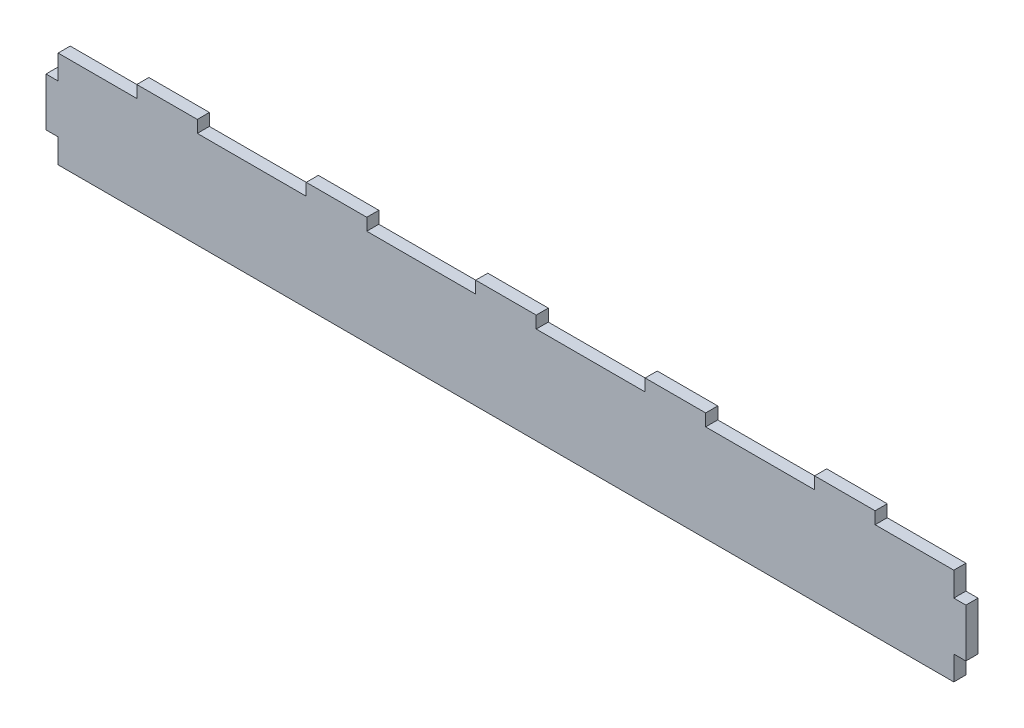
ISO-10303-21;
HEADER;
FILE_DESCRIPTION(('STEP AP214'),'2;1');
FILE_NAME('part.step','',(''),(''),'','','');
FILE_SCHEMA(('AUTOMOTIVE_DESIGN { 1 0 10303 214 1 1 1 1 }'));
ENDSEC;
DATA;
#1=APPLICATION_CONTEXT('core data for automotive mechanical design processes');
#2=APPLICATION_PROTOCOL_DEFINITION('international standard','automotive_design',2000,#1);
#3=PRODUCT_CONTEXT('',#1,'mechanical');
#4=PRODUCT('Part','Part','',(#3));
#5=PRODUCT_RELATED_PRODUCT_CATEGORY('part','',(#4));
#6=PRODUCT_DEFINITION_FORMATION('','',#4);
#7=PRODUCT_DEFINITION_CONTEXT('part definition',#1,'design');
#8=PRODUCT_DEFINITION('design','',#6,#7);
#9=PRODUCT_DEFINITION_SHAPE('','',#8);
#10=(LENGTH_UNIT() NAMED_UNIT(*) SI_UNIT(.MILLI.,.METRE.));
#11=(NAMED_UNIT(*) PLANE_ANGLE_UNIT() SI_UNIT($,.RADIAN.));
#12=(NAMED_UNIT(*) SI_UNIT($,.STERADIAN.) SOLID_ANGLE_UNIT());
#13=UNCERTAINTY_MEASURE_WITH_UNIT(LENGTH_MEASURE(1.E-05),#10,'distance_accuracy_value','');
#14=(GEOMETRIC_REPRESENTATION_CONTEXT(3) GLOBAL_UNCERTAINTY_ASSIGNED_CONTEXT((#13)) GLOBAL_UNIT_ASSIGNED_CONTEXT((#10,
#11,#12)) REPRESENTATION_CONTEXT('',''));
#15=CARTESIAN_POINT('',(0.,0.,0.));
#16=DIRECTION('',(0.,0.,1.));
#17=DIRECTION('',(1.,0.,0.));
#18=AXIS2_PLACEMENT_3D('',#15,#16,#17);
#19=CARTESIAN_POINT('',(72.5000000000003,0.,2.5));
#20=DIRECTION('',(-1.,0.,0.));
#21=DIRECTION('',(0.,0.,1.));
#22=AXIS2_PLACEMENT_3D('',#19,#20,#21);
#23=PLANE('',#22);
#24=DIRECTION('',(0.,1.,0.));
#25=VECTOR('',#24,1.);
#26=CARTESIAN_POINT('',(72.5000000000003,0.,-2.5));
#27=LINE('',#26,#25);
#28=CARTESIAN_POINT('',(72.5000000000003,-24.9999999999885,-2.5));
#29=VERTEX_POINT('',#28);
#30=CARTESIAN_POINT('',(72.5000000000003,-19.9999999999999,-2.5));
#31=VERTEX_POINT('',#30);
#32=EDGE_CURVE('E277',#29,#31,#27,.T.);
#33=ORIENTED_EDGE('',*,*,#32,.F.);
#34=DIRECTION('',(0.,0.,-1.));
#35=VECTOR('',#34,1.);
#36=CARTESIAN_POINT('',(72.5000000000003,-24.9999999999885,2.5));
#37=LINE('',#36,#35);
#38=CARTESIAN_POINT('',(72.5000000000003,-24.9999999999885,2.5));
#39=VERTEX_POINT('',#38);
#40=EDGE_CURVE('E11',#39,#29,#37,.T.);
#41=ORIENTED_EDGE('',*,*,#40,.F.);
#42=DIRECTION('',(0.,1.,0.));
#43=VECTOR('',#42,1.);
#44=CARTESIAN_POINT('',(72.5000000000003,0.,2.5));
#45=LINE('',#44,#43);
#46=CARTESIAN_POINT('',(72.5000000000003,-19.9999999999999,2.5));
#47=VERTEX_POINT('',#46);
#48=EDGE_CURVE('E362',#39,#47,#45,.T.);
#49=ORIENTED_EDGE('',*,*,#48,.T.);
#50=DIRECTION('',(0.,0.,-1.));
#51=VECTOR('',#50,1.);
#52=CARTESIAN_POINT('',(72.5000000000003,-19.9999999999999,2.5));
#53=LINE('',#52,#51);
#54=EDGE_CURVE('E55',#47,#31,#53,.T.);
#55=ORIENTED_EDGE('',*,*,#54,.T.);
#56=EDGE_LOOP('',(#33,#41,#49,#55));
#57=FACE_BOUND('',#56,.T.);
#58=ADVANCED_FACE('F39',(#57),#23,.T.);
#59=CARTESIAN_POINT('',(0.,-24.9999999999885,2.5));
#60=DIRECTION('',(0.,-1.,0.));
#61=DIRECTION('',(0.,0.,-1.));
#62=AXIS2_PLACEMENT_3D('',#59,#60,#61);
#63=PLANE('',#62);
#64=DIRECTION('',(-1.,0.,0.));
#65=VECTOR('',#64,1.);
#66=CARTESIAN_POINT('',(0.,-24.9999999999885,-2.5));
#67=LINE('',#66,#65);
#68=CARTESIAN_POINT('',(40.,-24.9999999999885,-2.5));
#69=VERTEX_POINT('',#68);
#70=EDGE_CURVE('E279',#29,#69,#67,.T.);
#71=ORIENTED_EDGE('',*,*,#70,.T.);
#72=DIRECTION('',(0.,0.,-1.));
#73=VECTOR('',#72,1.);
#74=CARTESIAN_POINT('',(40.,-24.9999999999885,2.5));
#75=LINE('',#74,#73);
#76=CARTESIAN_POINT('',(40.,-24.9999999999885,2.5));
#77=VERTEX_POINT('',#76);
#78=EDGE_CURVE('E47',#77,#69,#75,.T.);
#79=ORIENTED_EDGE('',*,*,#78,.F.);
#80=DIRECTION('',(-1.,0.,0.));
#81=VECTOR('',#80,1.);
#82=CARTESIAN_POINT('',(0.,-24.9999999999885,2.5));
#83=LINE('',#82,#81);
#84=EDGE_CURVE('E448',#39,#77,#83,.T.);
#85=ORIENTED_EDGE('',*,*,#84,.F.);
#86=ORIENTED_EDGE('',*,*,#40,.T.);
#87=EDGE_LOOP('',(#71,#79,#85,#86));
#88=FACE_BOUND('',#87,.T.);
#89=ADVANCED_FACE('F523',(#88),#63,.F.);
#90=CARTESIAN_POINT('',(40.,0.,2.5));
#91=DIRECTION('',(1.,0.,0.));
#92=DIRECTION('',(0.,0.,-1.));
#93=AXIS2_PLACEMENT_3D('',#90,#91,#92);
#94=PLANE('',#93);
#95=DIRECTION('',(0.,-1.,0.));
#96=VECTOR('',#95,1.);
#97=CARTESIAN_POINT('',(40.,0.,-2.5));
#98=LINE('',#97,#96);
#99=CARTESIAN_POINT('',(40.,-34.9999999999883,-2.5));
#100=VERTEX_POINT('',#99);
#101=EDGE_CURVE('E281',#69,#100,#98,.T.);
#102=ORIENTED_EDGE('',*,*,#101,.T.);
#103=DIRECTION('',(0.,0.,-1.));
#104=VECTOR('',#103,1.);
#105=CARTESIAN_POINT('',(40.,-34.9999999999883,2.5));
#106=LINE('',#105,#104);
#107=CARTESIAN_POINT('',(40.,-34.9999999999883,2.5));
#108=VERTEX_POINT('',#107);
#109=EDGE_CURVE('E421',#108,#100,#106,.T.);
#110=ORIENTED_EDGE('',*,*,#109,.F.);
#111=DIRECTION('',(0.,-1.,0.));
#112=VECTOR('',#111,1.);
#113=CARTESIAN_POINT('',(40.,0.,2.5));
#114=LINE('',#113,#112);
#115=EDGE_CURVE('E430',#77,#108,#114,.T.);
#116=ORIENTED_EDGE('',*,*,#115,.F.);
#117=ORIENTED_EDGE('',*,*,#78,.T.);
#118=EDGE_LOOP('',(#102,#110,#116,#117));
#119=FACE_BOUND('',#118,.T.);
#120=ADVANCED_FACE('F428',(#119),#94,.F.);
#121=CARTESIAN_POINT('',(0.,-34.9999999999883,2.5));
#122=DIRECTION('',(0.,-1.,0.));
#123=DIRECTION('',(0.,0.,-1.));
#124=AXIS2_PLACEMENT_3D('',#121,#122,#123);
#125=PLANE('',#124);
#126=DIRECTION('',(-1.,0.,0.));
#127=VECTOR('',#126,1.);
#128=CARTESIAN_POINT('',(0.,-34.9999999999883,-2.5));
#129=LINE('',#128,#127);
#130=CARTESIAN_POINT('',(35.,-34.9999999999883,-2.5));
#131=VERTEX_POINT('',#130);
#132=EDGE_CURVE('E283',#100,#131,#129,.T.);
#133=ORIENTED_EDGE('',*,*,#132,.T.);
#134=DIRECTION('',(0.,0.,-1.));
#135=VECTOR('',#134,1.);
#136=CARTESIAN_POINT('',(35.,-34.9999999999883,2.5));
#137=LINE('',#136,#135);
#138=CARTESIAN_POINT('',(35.,-34.9999999999883,2.5));
#139=VERTEX_POINT('',#138);
#140=EDGE_CURVE('E419',#139,#131,#137,.T.);
#141=ORIENTED_EDGE('',*,*,#140,.F.);
#142=DIRECTION('',(-1.,0.,0.));
#143=VECTOR('',#142,1.);
#144=CARTESIAN_POINT('',(0.,-34.9999999999883,2.5));
#145=LINE('',#144,#143);
#146=EDGE_CURVE('E442',#108,#139,#145,.T.);
#147=ORIENTED_EDGE('',*,*,#146,.F.);
#148=ORIENTED_EDGE('',*,*,#109,.T.);
#149=EDGE_LOOP('',(#133,#141,#147,#148));
#150=FACE_BOUND('',#149,.T.);
#151=ADVANCED_FACE('F439',(#150),#125,.F.);
#152=CARTESIAN_POINT('',(34.9999999999999,0.,2.5));
#153=DIRECTION('',(-1.,0.,0.));
#154=DIRECTION('',(0.,-1.,0.));
#155=AXIS2_PLACEMENT_3D('',#152,#153,#154);
#156=PLANE('',#155);
#157=DIRECTION('',(0.,1.,0.));
#158=VECTOR('',#157,1.);
#159=CARTESIAN_POINT('',(34.9999999999999,0.,-2.5));
#160=LINE('',#159,#158);
#161=CARTESIAN_POINT('',(35.,-54.9999999999883,-2.5));
#162=VERTEX_POINT('',#161);
#163=EDGE_CURVE('E286',#162,#131,#160,.T.);
#164=ORIENTED_EDGE('',*,*,#163,.F.);
#165=DIRECTION('',(0.,0.,-1.));
#166=VECTOR('',#165,1.);
#167=CARTESIAN_POINT('',(35.,-54.9999999999883,2.5));
#168=LINE('',#167,#166);
#169=CARTESIAN_POINT('',(35.,-54.9999999999883,2.5));
#170=VERTEX_POINT('',#169);
#171=EDGE_CURVE('E417',#170,#162,#168,.T.);
#172=ORIENTED_EDGE('',*,*,#171,.F.);
#173=DIRECTION('',(0.,1.,0.));
#174=VECTOR('',#173,1.);
#175=CARTESIAN_POINT('',(34.9999999999999,0.,2.5));
#176=LINE('',#175,#174);
#177=EDGE_CURVE('E444',#170,#139,#176,.T.);
#178=ORIENTED_EDGE('',*,*,#177,.T.);
#179=ORIENTED_EDGE('',*,*,#140,.T.);
#180=EDGE_LOOP('',(#164,#172,#178,#179));
#181=FACE_BOUND('',#180,.T.);
#182=ADVANCED_FACE('F534',(#181),#156,.T.);
#183=CARTESIAN_POINT('',(0.,-54.9999999999883,2.5));
#184=DIRECTION('',(0.,-1.,0.));
#185=DIRECTION('',(0.,0.,-1.));
#186=AXIS2_PLACEMENT_3D('',#183,#184,#185);
#187=PLANE('',#186);
#188=DIRECTION('',(-1.,0.,0.));
#189=VECTOR('',#188,1.);
#190=CARTESIAN_POINT('',(0.,-54.9999999999883,-2.5));
#191=LINE('',#190,#189);
#192=CARTESIAN_POINT('',(40.,-54.9999999999883,-2.5));
#193=VERTEX_POINT('',#192);
#194=EDGE_CURVE('E289',#193,#162,#191,.T.);
#195=ORIENTED_EDGE('',*,*,#194,.F.);
#196=DIRECTION('',(0.,0.,-1.));
#197=VECTOR('',#196,1.);
#198=CARTESIAN_POINT('',(40.,-54.9999999999883,2.5));
#199=LINE('',#198,#197);
#200=CARTESIAN_POINT('',(40.,-54.9999999999883,2.5));
#201=VERTEX_POINT('',#200);
#202=EDGE_CURVE('E415',#201,#193,#199,.T.);
#203=ORIENTED_EDGE('',*,*,#202,.F.);
#204=DIRECTION('',(-1.,0.,0.));
#205=VECTOR('',#204,1.);
#206=CARTESIAN_POINT('',(0.,-54.9999999999883,2.5));
#207=LINE('',#206,#205);
#208=EDGE_CURVE('E446',#201,#170,#207,.T.);
#209=ORIENTED_EDGE('',*,*,#208,.T.);
#210=ORIENTED_EDGE('',*,*,#171,.T.);
#211=EDGE_LOOP('',(#195,#203,#209,#210));
#212=FACE_BOUND('',#211,.T.);
#213=ADVANCED_FACE('F537',(#212),#187,.T.);
#214=CARTESIAN_POINT('',(40.,0.,2.5));
#215=DIRECTION('',(1.,0.,0.));
#216=DIRECTION('',(0.,0.,-1.));
#217=AXIS2_PLACEMENT_3D('',#214,#215,#216);
#218=PLANE('',#217);
#219=DIRECTION('',(0.,-1.,0.));
#220=VECTOR('',#219,1.);
#221=CARTESIAN_POINT('',(40.,0.,-2.5));
#222=LINE('',#221,#220);
#223=CARTESIAN_POINT('',(40.,-64.9999999999886,-2.5));
#224=VERTEX_POINT('',#223);
#225=EDGE_CURVE('E292',#193,#224,#222,.T.);
#226=ORIENTED_EDGE('',*,*,#225,.T.);
#227=DIRECTION('',(0.,0.,-1.));
#228=VECTOR('',#227,1.);
#229=CARTESIAN_POINT('',(40.,-64.9999999999886,2.5));
#230=LINE('',#229,#228);
#231=CARTESIAN_POINT('',(40.,-64.9999999999886,2.5));
#232=VERTEX_POINT('',#231);
#233=EDGE_CURVE('E413',#232,#224,#230,.T.);
#234=ORIENTED_EDGE('',*,*,#233,.F.);
#235=DIRECTION('',(0.,-1.,0.));
#236=VECTOR('',#235,1.);
#237=CARTESIAN_POINT('',(40.,0.,2.5));
#238=LINE('',#237,#236);
#239=EDGE_CURVE('E454',#201,#232,#238,.T.);
#240=ORIENTED_EDGE('',*,*,#239,.F.);
#241=ORIENTED_EDGE('',*,*,#202,.T.);
#242=EDGE_LOOP('',(#226,#234,#240,#241));
#243=FACE_BOUND('',#242,.T.);
#244=ADVANCED_FACE('F541',(#243),#218,.F.);
#245=CARTESIAN_POINT('',(0.,-64.9999999999886,2.5));
#246=DIRECTION('',(0.,-1.,0.));
#247=DIRECTION('',(1.,0.,0.));
#248=AXIS2_PLACEMENT_3D('',#245,#246,#247);
#249=PLANE('',#248);
#250=DIRECTION('',(-1.,0.,0.));
#251=VECTOR('',#250,1.);
#252=CARTESIAN_POINT('',(0.,-64.9999999999886,-2.5));
#253=LINE('',#252,#251);
#254=CARTESIAN_POINT('',(410.000000000001,-64.9999999999885,-2.5));
#255=VERTEX_POINT('',#254);
#256=EDGE_CURVE('E295',#255,#224,#253,.T.);
#257=ORIENTED_EDGE('',*,*,#256,.F.);
#258=DIRECTION('',(0.,0.,-1.));
#259=VECTOR('',#258,1.);
#260=CARTESIAN_POINT('',(410.000000000001,-64.9999999999885,2.5));
#261=LINE('',#260,#259);
#262=CARTESIAN_POINT('',(410.000000000001,-64.9999999999885,2.5));
#263=VERTEX_POINT('',#262);
#264=EDGE_CURVE('E411',#263,#255,#261,.T.);
#265=ORIENTED_EDGE('',*,*,#264,.F.);
#266=DIRECTION('',(-1.,0.,0.));
#267=VECTOR('',#266,1.);
#268=CARTESIAN_POINT('',(0.,-64.9999999999886,2.5));
#269=LINE('',#268,#267);
#270=EDGE_CURVE('E456',#263,#232,#269,.T.);
#271=ORIENTED_EDGE('',*,*,#270,.T.);
#272=ORIENTED_EDGE('',*,*,#233,.T.);
#273=EDGE_LOOP('',(#257,#265,#271,#272));
#274=FACE_BOUND('',#273,.T.);
#275=ADVANCED_FACE('F545',(#274),#249,.T.);
#276=CARTESIAN_POINT('',(410.000000000001,0.,2.5));
#277=DIRECTION('',(1.,0.,0.));
#278=DIRECTION('',(0.,0.,-1.));
#279=AXIS2_PLACEMENT_3D('',#276,#277,#278);
#280=PLANE('',#279);
#281=DIRECTION('',(0.,-1.,0.));
#282=VECTOR('',#281,1.);
#283=CARTESIAN_POINT('',(410.000000000001,0.,-2.5));
#284=LINE('',#283,#282);
#285=CARTESIAN_POINT('',(410.000000000001,-54.9999999999883,-2.5));
#286=VERTEX_POINT('',#285);
#287=EDGE_CURVE('E298',#286,#255,#284,.T.);
#288=ORIENTED_EDGE('',*,*,#287,.F.);
#289=DIRECTION('',(0.,0.,-1.));
#290=VECTOR('',#289,1.);
#291=CARTESIAN_POINT('',(410.000000000001,-54.9999999999883,2.5));
#292=LINE('',#291,#290);
#293=CARTESIAN_POINT('',(410.000000000001,-54.9999999999883,2.5));
#294=VERTEX_POINT('',#293);
#295=EDGE_CURVE('E409',#294,#286,#292,.T.);
#296=ORIENTED_EDGE('',*,*,#295,.F.);
#297=DIRECTION('',(0.,-1.,0.));
#298=VECTOR('',#297,1.);
#299=CARTESIAN_POINT('',(410.000000000001,0.,2.5));
#300=LINE('',#299,#298);
#301=EDGE_CURVE('E459',#294,#263,#300,.T.);
#302=ORIENTED_EDGE('',*,*,#301,.T.);
#303=ORIENTED_EDGE('',*,*,#264,.T.);
#304=EDGE_LOOP('',(#288,#296,#302,#303));
#305=FACE_BOUND('',#304,.T.);
#306=ADVANCED_FACE('F549',(#305),#280,.T.);
#307=CARTESIAN_POINT('',(0.,-54.9999999999883,2.5));
#308=DIRECTION('',(0.,1.,0.));
#309=DIRECTION('',(0.,0.,1.));
#310=AXIS2_PLACEMENT_3D('',#307,#308,#309);
#311=PLANE('',#310);
#312=DIRECTION('',(1.,0.,0.));
#313=VECTOR('',#312,1.);
#314=CARTESIAN_POINT('',(0.,-54.9999999999883,-2.5));
#315=LINE('',#314,#313);
#316=CARTESIAN_POINT('',(415.000000000001,-54.9999999999883,-2.5));
#317=VERTEX_POINT('',#316);
#318=EDGE_CURVE('E301',#286,#317,#315,.T.);
#319=ORIENTED_EDGE('',*,*,#318,.T.);
#320=DIRECTION('',(0.,0.,-1.));
#321=VECTOR('',#320,1.);
#322=CARTESIAN_POINT('',(415.000000000001,-54.9999999999883,2.5));
#323=LINE('',#322,#321);
#324=CARTESIAN_POINT('',(415.000000000001,-54.9999999999883,2.5));
#325=VERTEX_POINT('',#324);
#326=EDGE_CURVE('E406',#325,#317,#323,.T.);
#327=ORIENTED_EDGE('',*,*,#326,.F.);
#328=DIRECTION('',(1.,0.,0.));
#329=VECTOR('',#328,1.);
#330=CARTESIAN_POINT('',(0.,-54.9999999999883,2.5));
#331=LINE('',#330,#329);
#332=EDGE_CURVE('E462',#294,#325,#331,.T.);
#333=ORIENTED_EDGE('',*,*,#332,.F.);
#334=ORIENTED_EDGE('',*,*,#295,.T.);
#335=EDGE_LOOP('',(#319,#327,#333,#334));
#336=FACE_BOUND('',#335,.T.);
#337=ADVANCED_FACE('F553',(#336),#311,.F.);
#338=CARTESIAN_POINT('',(415.000000000001,-1.1518563880486E-12,2.5));
#339=DIRECTION('',(-1.,0.,0.));
#340=DIRECTION('',(0.,-1.,0.));
#341=AXIS2_PLACEMENT_3D('',#338,#339,#340);
#342=PLANE('',#341);
#343=DIRECTION('',(0.,1.,0.));
#344=VECTOR('',#343,1.);
#345=CARTESIAN_POINT('',(415.000000000001,-1.1518563880486E-12,-2.5));
#346=LINE('',#345,#344);
#347=CARTESIAN_POINT('',(415.000000000001,-34.9999999999883,-2.5));
#348=VERTEX_POINT('',#347);
#349=EDGE_CURVE('E303',#317,#348,#346,.T.);
#350=ORIENTED_EDGE('',*,*,#349,.T.);
#351=DIRECTION('',(0.,0.,-1.));
#352=VECTOR('',#351,1.);
#353=CARTESIAN_POINT('',(415.000000000001,-34.9999999999883,2.5));
#354=LINE('',#353,#352);
#355=CARTESIAN_POINT('',(415.000000000001,-34.9999999999883,2.5));
#356=VERTEX_POINT('',#355);
#357=EDGE_CURVE('E404',#356,#348,#354,.T.);
#358=ORIENTED_EDGE('',*,*,#357,.F.);
#359=DIRECTION('',(0.,1.,0.));
#360=VECTOR('',#359,1.);
#361=CARTESIAN_POINT('',(415.000000000001,-1.1518563880486E-12,2.5));
#362=LINE('',#361,#360);
#363=EDGE_CURVE('E464',#325,#356,#362,.T.);
#364=ORIENTED_EDGE('',*,*,#363,.F.);
#365=ORIENTED_EDGE('',*,*,#326,.T.);
#366=EDGE_LOOP('',(#350,#358,#364,#365));
#367=FACE_BOUND('',#366,.T.);
#368=ADVANCED_FACE('F557',(#367),#342,.F.);
#369=CARTESIAN_POINT('',(0.,-34.9999999999883,2.5));
#370=DIRECTION('',(0.,1.,0.));
#371=DIRECTION('',(0.,0.,1.));
#372=AXIS2_PLACEMENT_3D('',#369,#370,#371);
#373=PLANE('',#372);
#374=DIRECTION('',(1.,0.,0.));
#375=VECTOR('',#374,1.);
#376=CARTESIAN_POINT('',(0.,-34.9999999999883,-2.5));
#377=LINE('',#376,#375);
#378=CARTESIAN_POINT('',(410.000000000001,-34.9999999999883,-2.5));
#379=VERTEX_POINT('',#378);
#380=EDGE_CURVE('E306',#379,#348,#377,.T.);
#381=ORIENTED_EDGE('',*,*,#380,.F.);
#382=DIRECTION('',(0.,0.,-1.));
#383=VECTOR('',#382,1.);
#384=CARTESIAN_POINT('',(410.000000000001,-34.9999999999883,2.5));
#385=LINE('',#384,#383);
#386=CARTESIAN_POINT('',(410.000000000001,-34.9999999999883,2.5));
#387=VERTEX_POINT('',#386);
#388=EDGE_CURVE('E402',#387,#379,#385,.T.);
#389=ORIENTED_EDGE('',*,*,#388,.F.);
#390=DIRECTION('',(1.,0.,0.));
#391=VECTOR('',#390,1.);
#392=CARTESIAN_POINT('',(0.,-34.9999999999883,2.5));
#393=LINE('',#392,#391);
#394=EDGE_CURVE('E466',#387,#356,#393,.T.);
#395=ORIENTED_EDGE('',*,*,#394,.T.);
#396=ORIENTED_EDGE('',*,*,#357,.T.);
#397=EDGE_LOOP('',(#381,#389,#395,#396));
#398=FACE_BOUND('',#397,.T.);
#399=ADVANCED_FACE('F561',(#398),#373,.T.);
#400=CARTESIAN_POINT('',(410.000000000001,0.,2.5));
#401=DIRECTION('',(1.,0.,0.));
#402=DIRECTION('',(0.,0.,-1.));
#403=AXIS2_PLACEMENT_3D('',#400,#401,#402);
#404=PLANE('',#403);
#405=DIRECTION('',(0.,-1.,0.));
#406=VECTOR('',#405,1.);
#407=CARTESIAN_POINT('',(410.000000000001,0.,-2.5));
#408=LINE('',#407,#406);
#409=CARTESIAN_POINT('',(410.000000000001,-24.9999999999885,-2.5));
#410=VERTEX_POINT('',#409);
#411=EDGE_CURVE('E309',#410,#379,#408,.T.);
#412=ORIENTED_EDGE('',*,*,#411,.F.);
#413=DIRECTION('',(0.,0.,-1.));
#414=VECTOR('',#413,1.);
#415=CARTESIAN_POINT('',(410.000000000001,-24.9999999999885,2.5));
#416=LINE('',#415,#414);
#417=CARTESIAN_POINT('',(410.000000000001,-24.9999999999885,2.5));
#418=VERTEX_POINT('',#417);
#419=EDGE_CURVE('E400',#418,#410,#416,.T.);
#420=ORIENTED_EDGE('',*,*,#419,.F.);
#421=DIRECTION('',(0.,-1.,0.));
#422=VECTOR('',#421,1.);
#423=CARTESIAN_POINT('',(410.000000000001,0.,2.5));
#424=LINE('',#423,#422);
#425=EDGE_CURVE('E469',#418,#387,#424,.T.);
#426=ORIENTED_EDGE('',*,*,#425,.T.);
#427=ORIENTED_EDGE('',*,*,#388,.T.);
#428=EDGE_LOOP('',(#412,#420,#426,#427));
#429=FACE_BOUND('',#428,.T.);
#430=ADVANCED_FACE('F565',(#429),#404,.T.);
#431=CARTESIAN_POINT('',(0.,-24.9999999999885,2.5));
#432=DIRECTION('',(0.,-1.,0.));
#433=DIRECTION('',(0.,0.,-1.));
#434=AXIS2_PLACEMENT_3D('',#431,#432,#433);
#435=PLANE('',#434);
#436=DIRECTION('',(-1.,0.,0.));
#437=VECTOR('',#436,1.);
#438=CARTESIAN_POINT('',(0.,-24.9999999999885,-2.5));
#439=LINE('',#438,#437);
#440=CARTESIAN_POINT('',(377.5,-24.9999999999885,-2.5));
#441=VERTEX_POINT('',#440);
#442=EDGE_CURVE('E312',#410,#441,#439,.T.);
#443=ORIENTED_EDGE('',*,*,#442,.T.);
#444=DIRECTION('',(0.,0.,-1.));
#445=VECTOR('',#444,1.);
#446=CARTESIAN_POINT('',(377.5,-24.9999999999885,2.5));
#447=LINE('',#446,#445);
#448=CARTESIAN_POINT('',(377.5,-24.9999999999885,2.5));
#449=VERTEX_POINT('',#448);
#450=EDGE_CURVE('E397',#449,#441,#447,.T.);
#451=ORIENTED_EDGE('',*,*,#450,.F.);
#452=DIRECTION('',(-1.,0.,0.));
#453=VECTOR('',#452,1.);
#454=CARTESIAN_POINT('',(0.,-24.9999999999885,2.5));
#455=LINE('',#454,#453);
#456=EDGE_CURVE('E472',#418,#449,#455,.T.);
#457=ORIENTED_EDGE('',*,*,#456,.F.);
#458=ORIENTED_EDGE('',*,*,#419,.T.);
#459=EDGE_LOOP('',(#443,#451,#457,#458));
#460=FACE_BOUND('',#459,.T.);
#461=ADVANCED_FACE('F569',(#460),#435,.F.);
#462=CARTESIAN_POINT('',(377.5,0.,2.5));
#463=DIRECTION('',(-1.,0.,0.));
#464=DIRECTION('',(0.,0.,1.));
#465=AXIS2_PLACEMENT_3D('',#462,#463,#464);
#466=PLANE('',#465);
#467=DIRECTION('',(0.,1.,0.));
#468=VECTOR('',#467,1.);
#469=CARTESIAN_POINT('',(377.5,0.,-2.5));
#470=LINE('',#469,#468);
#471=CARTESIAN_POINT('',(377.5,-19.9999999999999,-2.5));
#472=VERTEX_POINT('',#471);
#473=EDGE_CURVE('E314',#441,#472,#470,.T.);
#474=ORIENTED_EDGE('',*,*,#473,.T.);
#475=DIRECTION('',(0.,0.,-1.));
#476=VECTOR('',#475,1.);
#477=CARTESIAN_POINT('',(377.5,-19.9999999999999,2.5));
#478=LINE('',#477,#476);
#479=CARTESIAN_POINT('',(377.5,-19.9999999999999,2.5));
#480=VERTEX_POINT('',#479);
#481=EDGE_CURVE('E395',#480,#472,#478,.T.);
#482=ORIENTED_EDGE('',*,*,#481,.F.);
#483=DIRECTION('',(0.,1.,0.));
#484=VECTOR('',#483,1.);
#485=CARTESIAN_POINT('',(377.5,0.,2.5));
#486=LINE('',#485,#484);
#487=EDGE_CURVE('E474',#449,#480,#486,.T.);
#488=ORIENTED_EDGE('',*,*,#487,.F.);
#489=ORIENTED_EDGE('',*,*,#450,.T.);
#490=EDGE_LOOP('',(#474,#482,#488,#489));
#491=FACE_BOUND('',#490,.T.);
#492=ADVANCED_FACE('F573',(#491),#466,.F.);
#493=CARTESIAN_POINT('',(0.,-19.9999999999999,2.5));
#494=DIRECTION('',(0.,1.,0.));
#495=DIRECTION('',(0.,0.,1.));
#496=AXIS2_PLACEMENT_3D('',#493,#494,#495);
#497=PLANE('',#496);
#498=DIRECTION('',(1.,0.,0.));
#499=VECTOR('',#498,1.);
#500=CARTESIAN_POINT('',(0.,-19.9999999999999,-2.5));
#501=LINE('',#500,#499);
#502=CARTESIAN_POINT('',(352.5,-19.9999999999999,-2.5));
#503=VERTEX_POINT('',#502);
#504=EDGE_CURVE('E317',#503,#472,#501,.T.);
#505=ORIENTED_EDGE('',*,*,#504,.F.);
#506=DIRECTION('',(0.,0.,-1.));
#507=VECTOR('',#506,1.);
#508=CARTESIAN_POINT('',(352.5,-19.9999999999999,2.5));
#509=LINE('',#508,#507);
#510=CARTESIAN_POINT('',(352.5,-19.9999999999999,2.5));
#511=VERTEX_POINT('',#510);
#512=EDGE_CURVE('E393',#511,#503,#509,.T.);
#513=ORIENTED_EDGE('',*,*,#512,.F.);
#514=DIRECTION('',(1.,0.,0.));
#515=VECTOR('',#514,1.);
#516=CARTESIAN_POINT('',(0.,-19.9999999999999,2.5));
#517=LINE('',#516,#515);
#518=EDGE_CURVE('E476',#511,#480,#517,.T.);
#519=ORIENTED_EDGE('',*,*,#518,.T.);
#520=ORIENTED_EDGE('',*,*,#481,.T.);
#521=EDGE_LOOP('',(#505,#513,#519,#520));
#522=FACE_BOUND('',#521,.T.);
#523=ADVANCED_FACE('F577',(#522),#497,.T.);
#524=CARTESIAN_POINT('',(352.5,0.,2.5));
#525=DIRECTION('',(-1.,0.,0.));
#526=DIRECTION('',(0.,0.,1.));
#527=AXIS2_PLACEMENT_3D('',#524,#525,#526);
#528=PLANE('',#527);
#529=DIRECTION('',(0.,1.,0.));
#530=VECTOR('',#529,1.);
#531=CARTESIAN_POINT('',(352.5,0.,-2.5));
#532=LINE('',#531,#530);
#533=CARTESIAN_POINT('',(352.5,-24.9999999999885,-2.5));
#534=VERTEX_POINT('',#533);
#535=EDGE_CURVE('E320',#534,#503,#532,.T.);
#536=ORIENTED_EDGE('',*,*,#535,.F.);
#537=DIRECTION('',(0.,0.,-1.));
#538=VECTOR('',#537,1.);
#539=CARTESIAN_POINT('',(352.5,-24.9999999999885,2.5));
#540=LINE('',#539,#538);
#541=CARTESIAN_POINT('',(352.5,-24.9999999999885,2.5));
#542=VERTEX_POINT('',#541);
#543=EDGE_CURVE('E391',#542,#534,#540,.T.);
#544=ORIENTED_EDGE('',*,*,#543,.F.);
#545=DIRECTION('',(0.,1.,0.));
#546=VECTOR('',#545,1.);
#547=CARTESIAN_POINT('',(352.5,0.,2.5));
#548=LINE('',#547,#546);
#549=EDGE_CURVE('E479',#542,#511,#548,.T.);
#550=ORIENTED_EDGE('',*,*,#549,.T.);
#551=ORIENTED_EDGE('',*,*,#512,.T.);
#552=EDGE_LOOP('',(#536,#544,#550,#551));
#553=FACE_BOUND('',#552,.T.);
#554=ADVANCED_FACE('F581',(#553),#528,.T.);
#555=CARTESIAN_POINT('',(0.,-24.9999999999885,2.5));
#556=DIRECTION('',(0.,-1.,0.));
#557=DIRECTION('',(0.,0.,-1.));
#558=AXIS2_PLACEMENT_3D('',#555,#556,#557);
#559=PLANE('',#558);
#560=DIRECTION('',(-1.,0.,0.));
#561=VECTOR('',#560,1.);
#562=CARTESIAN_POINT('',(0.,-24.9999999999885,-2.5));
#563=LINE('',#562,#561);
#564=CARTESIAN_POINT('',(307.5,-24.9999999999885,-2.5));
#565=VERTEX_POINT('',#564);
#566=EDGE_CURVE('E323',#534,#565,#563,.T.);
#567=ORIENTED_EDGE('',*,*,#566,.T.);
#568=DIRECTION('',(0.,0.,-1.));
#569=VECTOR('',#568,1.);
#570=CARTESIAN_POINT('',(307.5,-24.9999999999885,2.5));
#571=LINE('',#570,#569);
#572=CARTESIAN_POINT('',(307.5,-24.9999999999885,2.5));
#573=VERTEX_POINT('',#572);
#574=EDGE_CURVE('E388',#573,#565,#571,.T.);
#575=ORIENTED_EDGE('',*,*,#574,.F.);
#576=DIRECTION('',(-1.,0.,0.));
#577=VECTOR('',#576,1.);
#578=CARTESIAN_POINT('',(0.,-24.9999999999885,2.5));
#579=LINE('',#578,#577);
#580=EDGE_CURVE('E482',#542,#573,#579,.T.);
#581=ORIENTED_EDGE('',*,*,#580,.F.);
#582=ORIENTED_EDGE('',*,*,#543,.T.);
#583=EDGE_LOOP('',(#567,#575,#581,#582));
#584=FACE_BOUND('',#583,.T.);
#585=ADVANCED_FACE('F585',(#584),#559,.F.);
#586=CARTESIAN_POINT('',(307.5,0.,2.5));
#587=DIRECTION('',(-1.,0.,0.));
#588=DIRECTION('',(0.,0.,1.));
#589=AXIS2_PLACEMENT_3D('',#586,#587,#588);
#590=PLANE('',#589);
#591=DIRECTION('',(0.,1.,0.));
#592=VECTOR('',#591,1.);
#593=CARTESIAN_POINT('',(307.5,0.,-2.5));
#594=LINE('',#593,#592);
#595=CARTESIAN_POINT('',(307.5,-19.9999999999999,-2.5));
#596=VERTEX_POINT('',#595);
#597=EDGE_CURVE('E325',#565,#596,#594,.T.);
#598=ORIENTED_EDGE('',*,*,#597,.T.);
#599=DIRECTION('',(0.,0.,-1.));
#600=VECTOR('',#599,1.);
#601=CARTESIAN_POINT('',(307.5,-19.9999999999999,2.5));
#602=LINE('',#601,#600);
#603=CARTESIAN_POINT('',(307.5,-19.9999999999999,2.5));
#604=VERTEX_POINT('',#603);
#605=EDGE_CURVE('E386',#604,#596,#602,.T.);
#606=ORIENTED_EDGE('',*,*,#605,.F.);
#607=DIRECTION('',(0.,1.,0.));
#608=VECTOR('',#607,1.);
#609=CARTESIAN_POINT('',(307.5,0.,2.5));
#610=LINE('',#609,#608);
#611=EDGE_CURVE('E484',#573,#604,#610,.T.);
#612=ORIENTED_EDGE('',*,*,#611,.F.);
#613=ORIENTED_EDGE('',*,*,#574,.T.);
#614=EDGE_LOOP('',(#598,#606,#612,#613));
#615=FACE_BOUND('',#614,.T.);
#616=ADVANCED_FACE('F589',(#615),#590,.F.);
#617=CARTESIAN_POINT('',(0.,-19.9999999999999,2.5));
#618=DIRECTION('',(0.,1.,0.));
#619=DIRECTION('',(0.,0.,1.));
#620=AXIS2_PLACEMENT_3D('',#617,#618,#619);
#621=PLANE('',#620);
#622=DIRECTION('',(1.,0.,0.));
#623=VECTOR('',#622,1.);
#624=CARTESIAN_POINT('',(0.,-19.9999999999999,-2.5));
#625=LINE('',#624,#623);
#626=CARTESIAN_POINT('',(282.5,-19.9999999999999,-2.5));
#627=VERTEX_POINT('',#626);
#628=EDGE_CURVE('E328',#627,#596,#625,.T.);
#629=ORIENTED_EDGE('',*,*,#628,.F.);
#630=DIRECTION('',(0.,0.,-1.));
#631=VECTOR('',#630,1.);
#632=CARTESIAN_POINT('',(282.5,-19.9999999999999,2.5));
#633=LINE('',#632,#631);
#634=CARTESIAN_POINT('',(282.5,-19.9999999999999,2.5));
#635=VERTEX_POINT('',#634);
#636=EDGE_CURVE('E384',#635,#627,#633,.T.);
#637=ORIENTED_EDGE('',*,*,#636,.F.);
#638=DIRECTION('',(1.,0.,0.));
#639=VECTOR('',#638,1.);
#640=CARTESIAN_POINT('',(0.,-19.9999999999999,2.5));
#641=LINE('',#640,#639);
#642=EDGE_CURVE('E486',#635,#604,#641,.T.);
#643=ORIENTED_EDGE('',*,*,#642,.T.);
#644=ORIENTED_EDGE('',*,*,#605,.T.);
#645=EDGE_LOOP('',(#629,#637,#643,#644));
#646=FACE_BOUND('',#645,.T.);
#647=ADVANCED_FACE('F593',(#646),#621,.T.);
#648=CARTESIAN_POINT('',(282.5,0.,2.5));
#649=DIRECTION('',(-1.,0.,0.));
#650=DIRECTION('',(0.,0.,1.));
#651=AXIS2_PLACEMENT_3D('',#648,#649,#650);
#652=PLANE('',#651);
#653=DIRECTION('',(0.,1.,0.));
#654=VECTOR('',#653,1.);
#655=CARTESIAN_POINT('',(282.5,0.,-2.5));
#656=LINE('',#655,#654);
#657=CARTESIAN_POINT('',(282.5,-24.9999999999885,-2.5));
#658=VERTEX_POINT('',#657);
#659=EDGE_CURVE('E331',#658,#627,#656,.T.);
#660=ORIENTED_EDGE('',*,*,#659,.F.);
#661=DIRECTION('',(0.,0.,-1.));
#662=VECTOR('',#661,1.);
#663=CARTESIAN_POINT('',(282.5,-24.9999999999885,2.5));
#664=LINE('',#663,#662);
#665=CARTESIAN_POINT('',(282.5,-24.9999999999885,2.5));
#666=VERTEX_POINT('',#665);
#667=EDGE_CURVE('E382',#666,#658,#664,.T.);
#668=ORIENTED_EDGE('',*,*,#667,.F.);
#669=DIRECTION('',(0.,1.,0.));
#670=VECTOR('',#669,1.);
#671=CARTESIAN_POINT('',(282.5,0.,2.5));
#672=LINE('',#671,#670);
#673=EDGE_CURVE('E489',#666,#635,#672,.T.);
#674=ORIENTED_EDGE('',*,*,#673,.T.);
#675=ORIENTED_EDGE('',*,*,#636,.T.);
#676=EDGE_LOOP('',(#660,#668,#674,#675));
#677=FACE_BOUND('',#676,.T.);
#678=ADVANCED_FACE('F597',(#677),#652,.T.);
#679=CARTESIAN_POINT('',(0.,-24.9999999999885,2.5));
#680=DIRECTION('',(0.,-1.,0.));
#681=DIRECTION('',(0.,0.,-1.));
#682=AXIS2_PLACEMENT_3D('',#679,#680,#681);
#683=PLANE('',#682);
#684=DIRECTION('',(-1.,0.,0.));
#685=VECTOR('',#684,1.);
#686=CARTESIAN_POINT('',(0.,-24.9999999999885,-2.5));
#687=LINE('',#686,#685);
#688=CARTESIAN_POINT('',(237.5,-24.9999999999885,-2.5));
#689=VERTEX_POINT('',#688);
#690=EDGE_CURVE('E334',#658,#689,#687,.T.);
#691=ORIENTED_EDGE('',*,*,#690,.T.);
#692=DIRECTION('',(0.,0.,-1.));
#693=VECTOR('',#692,1.);
#694=CARTESIAN_POINT('',(237.5,-24.9999999999885,2.5));
#695=LINE('',#694,#693);
#696=CARTESIAN_POINT('',(237.5,-24.9999999999885,2.5));
#697=VERTEX_POINT('',#696);
#698=EDGE_CURVE('E379',#697,#689,#695,.T.);
#699=ORIENTED_EDGE('',*,*,#698,.F.);
#700=DIRECTION('',(-1.,0.,0.));
#701=VECTOR('',#700,1.);
#702=CARTESIAN_POINT('',(0.,-24.9999999999885,2.5));
#703=LINE('',#702,#701);
#704=EDGE_CURVE('E492',#666,#697,#703,.T.);
#705=ORIENTED_EDGE('',*,*,#704,.F.);
#706=ORIENTED_EDGE('',*,*,#667,.T.);
#707=EDGE_LOOP('',(#691,#699,#705,#706));
#708=FACE_BOUND('',#707,.T.);
#709=ADVANCED_FACE('F601',(#708),#683,.F.);
#710=CARTESIAN_POINT('',(237.5,0.,2.5));
#711=DIRECTION('',(-1.,0.,0.));
#712=DIRECTION('',(0.,0.,1.));
#713=AXIS2_PLACEMENT_3D('',#710,#711,#712);
#714=PLANE('',#713);
#715=DIRECTION('',(0.,1.,0.));
#716=VECTOR('',#715,1.);
#717=CARTESIAN_POINT('',(237.5,0.,-2.5));
#718=LINE('',#717,#716);
#719=CARTESIAN_POINT('',(237.5,-19.9999999999999,-2.5));
#720=VERTEX_POINT('',#719);
#721=EDGE_CURVE('E336',#689,#720,#718,.T.);
#722=ORIENTED_EDGE('',*,*,#721,.T.);
#723=DIRECTION('',(0.,0.,-1.));
#724=VECTOR('',#723,1.);
#725=CARTESIAN_POINT('',(237.5,-19.9999999999999,2.5));
#726=LINE('',#725,#724);
#727=CARTESIAN_POINT('',(237.5,-19.9999999999999,2.5));
#728=VERTEX_POINT('',#727);
#729=EDGE_CURVE('E377',#728,#720,#726,.T.);
#730=ORIENTED_EDGE('',*,*,#729,.F.);
#731=DIRECTION('',(0.,1.,0.));
#732=VECTOR('',#731,1.);
#733=CARTESIAN_POINT('',(237.5,0.,2.5));
#734=LINE('',#733,#732);
#735=EDGE_CURVE('E494',#697,#728,#734,.T.);
#736=ORIENTED_EDGE('',*,*,#735,.F.);
#737=ORIENTED_EDGE('',*,*,#698,.T.);
#738=EDGE_LOOP('',(#722,#730,#736,#737));
#739=FACE_BOUND('',#738,.T.);
#740=ADVANCED_FACE('F605',(#739),#714,.F.);
#741=CARTESIAN_POINT('',(0.,-19.9999999999999,2.5));
#742=DIRECTION('',(0.,1.,0.));
#743=DIRECTION('',(0.,0.,1.));
#744=AXIS2_PLACEMENT_3D('',#741,#742,#743);
#745=PLANE('',#744);
#746=DIRECTION('',(1.,0.,0.));
#747=VECTOR('',#746,1.);
#748=CARTESIAN_POINT('',(0.,-19.9999999999999,-2.5));
#749=LINE('',#748,#747);
#750=CARTESIAN_POINT('',(212.5,-19.9999999999999,-2.5));
#751=VERTEX_POINT('',#750);
#752=EDGE_CURVE('E339',#751,#720,#749,.T.);
#753=ORIENTED_EDGE('',*,*,#752,.F.);
#754=DIRECTION('',(0.,0.,-1.));
#755=VECTOR('',#754,1.);
#756=CARTESIAN_POINT('',(212.5,-19.9999999999999,2.5));
#757=LINE('',#756,#755);
#758=CARTESIAN_POINT('',(212.5,-19.9999999999999,2.5));
#759=VERTEX_POINT('',#758);
#760=EDGE_CURVE('E375',#759,#751,#757,.T.);
#761=ORIENTED_EDGE('',*,*,#760,.F.);
#762=DIRECTION('',(1.,0.,0.));
#763=VECTOR('',#762,1.);
#764=CARTESIAN_POINT('',(0.,-19.9999999999999,2.5));
#765=LINE('',#764,#763);
#766=EDGE_CURVE('E496',#759,#728,#765,.T.);
#767=ORIENTED_EDGE('',*,*,#766,.T.);
#768=ORIENTED_EDGE('',*,*,#729,.T.);
#769=EDGE_LOOP('',(#753,#761,#767,#768));
#770=FACE_BOUND('',#769,.T.);
#771=ADVANCED_FACE('F609',(#770),#745,.T.);
#772=CARTESIAN_POINT('',(212.5,0.,2.5));
#773=DIRECTION('',(-1.,0.,0.));
#774=DIRECTION('',(0.,0.,1.));
#775=AXIS2_PLACEMENT_3D('',#772,#773,#774);
#776=PLANE('',#775);
#777=DIRECTION('',(0.,1.,0.));
#778=VECTOR('',#777,1.);
#779=CARTESIAN_POINT('',(212.5,0.,-2.5));
#780=LINE('',#779,#778);
#781=CARTESIAN_POINT('',(212.5,-24.9999999999885,-2.5));
#782=VERTEX_POINT('',#781);
#783=EDGE_CURVE('E342',#782,#751,#780,.T.);
#784=ORIENTED_EDGE('',*,*,#783,.F.);
#785=DIRECTION('',(0.,0.,-1.));
#786=VECTOR('',#785,1.);
#787=CARTESIAN_POINT('',(212.5,-24.9999999999885,2.5));
#788=LINE('',#787,#786);
#789=CARTESIAN_POINT('',(212.5,-24.9999999999885,2.5));
#790=VERTEX_POINT('',#789);
#791=EDGE_CURVE('E373',#790,#782,#788,.T.);
#792=ORIENTED_EDGE('',*,*,#791,.F.);
#793=DIRECTION('',(0.,1.,0.));
#794=VECTOR('',#793,1.);
#795=CARTESIAN_POINT('',(212.5,0.,2.5));
#796=LINE('',#795,#794);
#797=EDGE_CURVE('E499',#790,#759,#796,.T.);
#798=ORIENTED_EDGE('',*,*,#797,.T.);
#799=ORIENTED_EDGE('',*,*,#760,.T.);
#800=EDGE_LOOP('',(#784,#792,#798,#799));
#801=FACE_BOUND('',#800,.T.);
#802=ADVANCED_FACE('F613',(#801),#776,.T.);
#803=CARTESIAN_POINT('',(0.,-24.9999999999885,2.5));
#804=DIRECTION('',(0.,-1.,0.));
#805=DIRECTION('',(0.,0.,-1.));
#806=AXIS2_PLACEMENT_3D('',#803,#804,#805);
#807=PLANE('',#806);
#808=DIRECTION('',(-1.,0.,0.));
#809=VECTOR('',#808,1.);
#810=CARTESIAN_POINT('',(0.,-24.9999999999885,-2.5));
#811=LINE('',#810,#809);
#812=CARTESIAN_POINT('',(167.5,-24.9999999999885,-2.5));
#813=VERTEX_POINT('',#812);
#814=EDGE_CURVE('E345',#782,#813,#811,.T.);
#815=ORIENTED_EDGE('',*,*,#814,.T.);
#816=DIRECTION('',(0.,0.,-1.));
#817=VECTOR('',#816,1.);
#818=CARTESIAN_POINT('',(167.5,-24.9999999999885,2.5));
#819=LINE('',#818,#817);
#820=CARTESIAN_POINT('',(167.5,-24.9999999999885,2.5));
#821=VERTEX_POINT('',#820);
#822=EDGE_CURVE('E370',#821,#813,#819,.T.);
#823=ORIENTED_EDGE('',*,*,#822,.F.);
#824=DIRECTION('',(-1.,0.,0.));
#825=VECTOR('',#824,1.);
#826=CARTESIAN_POINT('',(0.,-24.9999999999885,2.5));
#827=LINE('',#826,#825);
#828=EDGE_CURVE('E502',#790,#821,#827,.T.);
#829=ORIENTED_EDGE('',*,*,#828,.F.);
#830=ORIENTED_EDGE('',*,*,#791,.T.);
#831=EDGE_LOOP('',(#815,#823,#829,#830));
#832=FACE_BOUND('',#831,.T.);
#833=ADVANCED_FACE('F617',(#832),#807,.F.);
#834=CARTESIAN_POINT('',(167.5,0.,2.5));
#835=DIRECTION('',(-1.,0.,0.));
#836=DIRECTION('',(0.,0.,1.));
#837=AXIS2_PLACEMENT_3D('',#834,#835,#836);
#838=PLANE('',#837);
#839=DIRECTION('',(0.,1.,0.));
#840=VECTOR('',#839,1.);
#841=CARTESIAN_POINT('',(167.5,0.,-2.5));
#842=LINE('',#841,#840);
#843=CARTESIAN_POINT('',(167.5,-19.9999999999999,-2.5));
#844=VERTEX_POINT('',#843);
#845=EDGE_CURVE('E347',#813,#844,#842,.T.);
#846=ORIENTED_EDGE('',*,*,#845,.T.);
#847=DIRECTION('',(0.,0.,-1.));
#848=VECTOR('',#847,1.);
#849=CARTESIAN_POINT('',(167.5,-19.9999999999999,2.5));
#850=LINE('',#849,#848);
#851=CARTESIAN_POINT('',(167.5,-19.9999999999999,2.5));
#852=VERTEX_POINT('',#851);
#853=EDGE_CURVE('E368',#852,#844,#850,.T.);
#854=ORIENTED_EDGE('',*,*,#853,.F.);
#855=DIRECTION('',(0.,1.,0.));
#856=VECTOR('',#855,1.);
#857=CARTESIAN_POINT('',(167.5,0.,2.5));
#858=LINE('',#857,#856);
#859=EDGE_CURVE('E504',#821,#852,#858,.T.);
#860=ORIENTED_EDGE('',*,*,#859,.F.);
#861=ORIENTED_EDGE('',*,*,#822,.T.);
#862=EDGE_LOOP('',(#846,#854,#860,#861));
#863=FACE_BOUND('',#862,.T.);
#864=ADVANCED_FACE('F621',(#863),#838,.F.);
#865=CARTESIAN_POINT('',(0.,-19.9999999999999,2.5));
#866=DIRECTION('',(0.,1.,0.));
#867=DIRECTION('',(0.,0.,1.));
#868=AXIS2_PLACEMENT_3D('',#865,#866,#867);
#869=PLANE('',#868);
#870=DIRECTION('',(1.,0.,0.));
#871=VECTOR('',#870,1.);
#872=CARTESIAN_POINT('',(0.,-19.9999999999999,-2.5));
#873=LINE('',#872,#871);
#874=CARTESIAN_POINT('',(142.5,-19.9999999999999,-2.5));
#875=VERTEX_POINT('',#874);
#876=EDGE_CURVE('E350',#875,#844,#873,.T.);
#877=ORIENTED_EDGE('',*,*,#876,.F.);
#878=DIRECTION('',(0.,0.,-1.));
#879=VECTOR('',#878,1.);
#880=CARTESIAN_POINT('',(142.5,-19.9999999999999,2.5));
#881=LINE('',#880,#879);
#882=CARTESIAN_POINT('',(142.5,-19.9999999999999,2.5));
#883=VERTEX_POINT('',#882);
#884=EDGE_CURVE('E366',#883,#875,#881,.T.);
#885=ORIENTED_EDGE('',*,*,#884,.F.);
#886=DIRECTION('',(1.,0.,0.));
#887=VECTOR('',#886,1.);
#888=CARTESIAN_POINT('',(0.,-19.9999999999999,2.5));
#889=LINE('',#888,#887);
#890=EDGE_CURVE('E506',#883,#852,#889,.T.);
#891=ORIENTED_EDGE('',*,*,#890,.T.);
#892=ORIENTED_EDGE('',*,*,#853,.T.);
#893=EDGE_LOOP('',(#877,#885,#891,#892));
#894=FACE_BOUND('',#893,.T.);
#895=ADVANCED_FACE('F625',(#894),#869,.T.);
#896=CARTESIAN_POINT('',(142.5,0.,2.5));
#897=DIRECTION('',(-1.,0.,0.));
#898=DIRECTION('',(0.,0.,1.));
#899=AXIS2_PLACEMENT_3D('',#896,#897,#898);
#900=PLANE('',#899);
#901=DIRECTION('',(0.,1.,0.));
#902=VECTOR('',#901,1.);
#903=CARTESIAN_POINT('',(142.5,0.,-2.5));
#904=LINE('',#903,#902);
#905=CARTESIAN_POINT('',(142.5,-24.9999999999885,-2.5));
#906=VERTEX_POINT('',#905);
#907=EDGE_CURVE('E353',#906,#875,#904,.T.);
#908=ORIENTED_EDGE('',*,*,#907,.F.);
#909=DIRECTION('',(0.,0.,-1.));
#910=VECTOR('',#909,1.);
#911=CARTESIAN_POINT('',(142.5,-24.9999999999885,2.5));
#912=LINE('',#911,#910);
#913=CARTESIAN_POINT('',(142.5,-24.9999999999885,2.5));
#914=VERTEX_POINT('',#913);
#915=EDGE_CURVE('E269',#914,#906,#912,.T.);
#916=ORIENTED_EDGE('',*,*,#915,.F.);
#917=DIRECTION('',(0.,1.,0.));
#918=VECTOR('',#917,1.);
#919=CARTESIAN_POINT('',(142.5,0.,2.5));
#920=LINE('',#919,#918);
#921=EDGE_CURVE('E259',#914,#883,#920,.T.);
#922=ORIENTED_EDGE('',*,*,#921,.T.);
#923=ORIENTED_EDGE('',*,*,#884,.T.);
#924=EDGE_LOOP('',(#908,#916,#922,#923));
#925=FACE_BOUND('',#924,.T.);
#926=ADVANCED_FACE('F510',(#925),#900,.T.);
#927=CARTESIAN_POINT('',(0.,-24.9999999999885,2.5));
#928=DIRECTION('',(0.,-1.,0.));
#929=DIRECTION('',(0.,0.,-1.));
#930=AXIS2_PLACEMENT_3D('',#927,#928,#929);
#931=PLANE('',#930);
#932=DIRECTION('',(-1.,0.,0.));
#933=VECTOR('',#932,1.);
#934=CARTESIAN_POINT('',(0.,-24.9999999999885,-2.5));
#935=LINE('',#934,#933);
#936=CARTESIAN_POINT('',(97.5000000000003,-24.9999999999885,-2.5));
#937=VERTEX_POINT('',#936);
#938=EDGE_CURVE('E266',#906,#937,#935,.T.);
#939=ORIENTED_EDGE('',*,*,#938,.T.);
#940=DIRECTION('',(0.,0.,-1.));
#941=VECTOR('',#940,1.);
#942=CARTESIAN_POINT('',(97.5000000000003,-24.9999999999885,2.5));
#943=LINE('',#942,#941);
#944=CARTESIAN_POINT('',(97.5000000000003,-24.9999999999885,2.5));
#945=VERTEX_POINT('',#944);
#946=EDGE_CURVE('E263',#945,#937,#943,.T.);
#947=ORIENTED_EDGE('',*,*,#946,.F.);
#948=DIRECTION('',(-1.,0.,0.));
#949=VECTOR('',#948,1.);
#950=CARTESIAN_POINT('',(0.,-24.9999999999885,2.5));
#951=LINE('',#950,#949);
#952=EDGE_CURVE('E250',#914,#945,#951,.T.);
#953=ORIENTED_EDGE('',*,*,#952,.F.);
#954=ORIENTED_EDGE('',*,*,#915,.T.);
#955=EDGE_LOOP('',(#939,#947,#953,#954));
#956=FACE_BOUND('',#955,.T.);
#957=ADVANCED_FACE('F264',(#956),#931,.F.);
#958=CARTESIAN_POINT('',(97.5000000000003,0.,2.5));
#959=DIRECTION('',(-1.,0.,0.));
#960=DIRECTION('',(0.,0.,1.));
#961=AXIS2_PLACEMENT_3D('',#958,#959,#960);
#962=PLANE('',#961);
#963=DIRECTION('',(0.,1.,0.));
#964=VECTOR('',#963,1.);
#965=CARTESIAN_POINT('',(97.5000000000003,0.,-2.5));
#966=LINE('',#965,#964);
#967=CARTESIAN_POINT('',(97.5000000000003,-19.9999999999999,-2.5));
#968=VERTEX_POINT('',#967);
#969=EDGE_CURVE('E357',#937,#968,#966,.T.);
#970=ORIENTED_EDGE('',*,*,#969,.T.);
#971=DIRECTION('',(0.,0.,-1.));
#972=VECTOR('',#971,1.);
#973=CARTESIAN_POINT('',(97.5000000000003,-19.9999999999999,2.5));
#974=LINE('',#973,#972);
#975=CARTESIAN_POINT('',(97.5000000000003,-19.9999999999999,2.5));
#976=VERTEX_POINT('',#975);
#977=EDGE_CURVE('E153',#976,#968,#974,.T.);
#978=ORIENTED_EDGE('',*,*,#977,.F.);
#979=DIRECTION('',(0.,1.,0.));
#980=VECTOR('',#979,1.);
#981=CARTESIAN_POINT('',(97.5000000000003,0.,2.5));
#982=LINE('',#981,#980);
#983=EDGE_CURVE('E256',#945,#976,#982,.T.);
#984=ORIENTED_EDGE('',*,*,#983,.F.);
#985=ORIENTED_EDGE('',*,*,#946,.T.);
#986=EDGE_LOOP('',(#970,#978,#984,#985));
#987=FACE_BOUND('',#986,.T.);
#988=ADVANCED_FACE('F271',(#987),#962,.F.);
#989=CARTESIAN_POINT('',(0.,-19.9999999999999,2.5));
#990=DIRECTION('',(0.,1.,0.));
#991=DIRECTION('',(0.,0.,1.));
#992=AXIS2_PLACEMENT_3D('',#989,#990,#991);
#993=PLANE('',#992);
#994=DIRECTION('',(1.,0.,0.));
#995=VECTOR('',#994,1.);
#996=CARTESIAN_POINT('',(0.,-19.9999999999999,-2.5));
#997=LINE('',#996,#995);
#998=EDGE_CURVE('E359',#31,#968,#997,.T.);
#999=ORIENTED_EDGE('',*,*,#998,.F.);
#1000=ORIENTED_EDGE('',*,*,#54,.F.);
#1001=DIRECTION('',(1.,0.,0.));
#1002=VECTOR('',#1001,1.);
#1003=CARTESIAN_POINT('',(0.,-19.9999999999999,2.5));
#1004=LINE('',#1003,#1002);
#1005=EDGE_CURVE('E272',#47,#976,#1004,.T.);
#1006=ORIENTED_EDGE('',*,*,#1005,.T.);
#1007=ORIENTED_EDGE('',*,*,#977,.T.);
#1008=EDGE_LOOP('',(#999,#1000,#1006,#1007));
#1009=FACE_BOUND('',#1008,.T.);
#1010=ADVANCED_FACE('F512',(#1009),#993,.T.);
#1011=CARTESIAN_POINT('',(0.,0.,2.5));
#1012=DIRECTION('',(0.,0.,1.));
#1013=DIRECTION('',(1.,0.,0.));
#1014=AXIS2_PLACEMENT_3D('',#1011,#1012,#1013);
#1015=PLANE('',#1014);
#1016=ORIENTED_EDGE('',*,*,#48,.F.);
#1017=ORIENTED_EDGE('',*,*,#84,.T.);
#1018=ORIENTED_EDGE('',*,*,#115,.T.);
#1019=ORIENTED_EDGE('',*,*,#146,.T.);
#1020=ORIENTED_EDGE('',*,*,#177,.F.);
#1021=ORIENTED_EDGE('',*,*,#208,.F.);
#1022=ORIENTED_EDGE('',*,*,#239,.T.);
#1023=ORIENTED_EDGE('',*,*,#270,.F.);
#1024=ORIENTED_EDGE('',*,*,#301,.F.);
#1025=ORIENTED_EDGE('',*,*,#332,.T.);
#1026=ORIENTED_EDGE('',*,*,#363,.T.);
#1027=ORIENTED_EDGE('',*,*,#394,.F.);
#1028=ORIENTED_EDGE('',*,*,#425,.F.);
#1029=ORIENTED_EDGE('',*,*,#456,.T.);
#1030=ORIENTED_EDGE('',*,*,#487,.T.);
#1031=ORIENTED_EDGE('',*,*,#518,.F.);
#1032=ORIENTED_EDGE('',*,*,#549,.F.);
#1033=ORIENTED_EDGE('',*,*,#580,.T.);
#1034=ORIENTED_EDGE('',*,*,#611,.T.);
#1035=ORIENTED_EDGE('',*,*,#642,.F.);
#1036=ORIENTED_EDGE('',*,*,#673,.F.);
#1037=ORIENTED_EDGE('',*,*,#704,.T.);
#1038=ORIENTED_EDGE('',*,*,#735,.T.);
#1039=ORIENTED_EDGE('',*,*,#766,.F.);
#1040=ORIENTED_EDGE('',*,*,#797,.F.);
#1041=ORIENTED_EDGE('',*,*,#828,.T.);
#1042=ORIENTED_EDGE('',*,*,#859,.T.);
#1043=ORIENTED_EDGE('',*,*,#890,.F.);
#1044=ORIENTED_EDGE('',*,*,#921,.F.);
#1045=ORIENTED_EDGE('',*,*,#952,.T.);
#1046=ORIENTED_EDGE('',*,*,#983,.T.);
#1047=ORIENTED_EDGE('',*,*,#1005,.F.);
#1048=EDGE_LOOP('',(#1016,#1017,#1018,#1019,#1020,#1021,#1022,#1023,#1024,#1025,#1026,#1027,
#1028,#1029,#1030,#1031,#1032,#1033,#1034,#1035,#1036,#1037,#1038,#1039,#1040,#1041,#1042,#1043,
#1044,#1045,#1046,#1047));
#1049=FACE_BOUND('',#1048,.T.);
#1050=ADVANCED_FACE('F253',(#1049),#1015,.T.);
#1051=CARTESIAN_POINT('',(0.,0.,-2.5));
#1052=DIRECTION('',(0.,0.,1.));
#1053=DIRECTION('',(1.,0.,0.));
#1054=AXIS2_PLACEMENT_3D('',#1051,#1052,#1053);
#1055=PLANE('',#1054);
#1056=ORIENTED_EDGE('',*,*,#32,.T.);
#1057=ORIENTED_EDGE('',*,*,#998,.T.);
#1058=ORIENTED_EDGE('',*,*,#969,.F.);
#1059=ORIENTED_EDGE('',*,*,#938,.F.);
#1060=ORIENTED_EDGE('',*,*,#907,.T.);
#1061=ORIENTED_EDGE('',*,*,#876,.T.);
#1062=ORIENTED_EDGE('',*,*,#845,.F.);
#1063=ORIENTED_EDGE('',*,*,#814,.F.);
#1064=ORIENTED_EDGE('',*,*,#783,.T.);
#1065=ORIENTED_EDGE('',*,*,#752,.T.);
#1066=ORIENTED_EDGE('',*,*,#721,.F.);
#1067=ORIENTED_EDGE('',*,*,#690,.F.);
#1068=ORIENTED_EDGE('',*,*,#659,.T.);
#1069=ORIENTED_EDGE('',*,*,#628,.T.);
#1070=ORIENTED_EDGE('',*,*,#597,.F.);
#1071=ORIENTED_EDGE('',*,*,#566,.F.);
#1072=ORIENTED_EDGE('',*,*,#535,.T.);
#1073=ORIENTED_EDGE('',*,*,#504,.T.);
#1074=ORIENTED_EDGE('',*,*,#473,.F.);
#1075=ORIENTED_EDGE('',*,*,#442,.F.);
#1076=ORIENTED_EDGE('',*,*,#411,.T.);
#1077=ORIENTED_EDGE('',*,*,#380,.T.);
#1078=ORIENTED_EDGE('',*,*,#349,.F.);
#1079=ORIENTED_EDGE('',*,*,#318,.F.);
#1080=ORIENTED_EDGE('',*,*,#287,.T.);
#1081=ORIENTED_EDGE('',*,*,#256,.T.);
#1082=ORIENTED_EDGE('',*,*,#225,.F.);
#1083=ORIENTED_EDGE('',*,*,#194,.T.);
#1084=ORIENTED_EDGE('',*,*,#163,.T.);
#1085=ORIENTED_EDGE('',*,*,#132,.F.);
#1086=ORIENTED_EDGE('',*,*,#101,.F.);
#1087=ORIENTED_EDGE('',*,*,#70,.F.);
#1088=EDGE_LOOP('',(#1056,#1057,#1058,#1059,#1060,#1061,#1062,#1063,#1064,#1065,#1066,#1067,
#1068,#1069,#1070,#1071,#1072,#1073,#1074,#1075,#1076,#1077,#1078,#1079,#1080,#1081,#1082,#1083,
#1084,#1085,#1086,#1087));
#1089=FACE_BOUND('',#1088,.T.);
#1090=ADVANCED_FACE('F435',(#1089),#1055,.F.);
#1091=CLOSED_SHELL('',(#58,#89,#120,#151,#182,#213,#244,#275,#306,#337,#368,#399,#430,#461,#492,
#523,#554,#585,#616,#647,#678,#709,#740,#771,#802,#833,#864,#895,#926,#957,#988,#1010,#1050,#1090));
#1092=MANIFOLD_SOLID_BREP('B2',#1091);
#1093=ADVANCED_BREP_SHAPE_REPRESENTATION('',(#18,#1092),#14);
#1094=SHAPE_DEFINITION_REPRESENTATION(#9,#1093);
ENDSEC;
END-ISO-10303-21;
